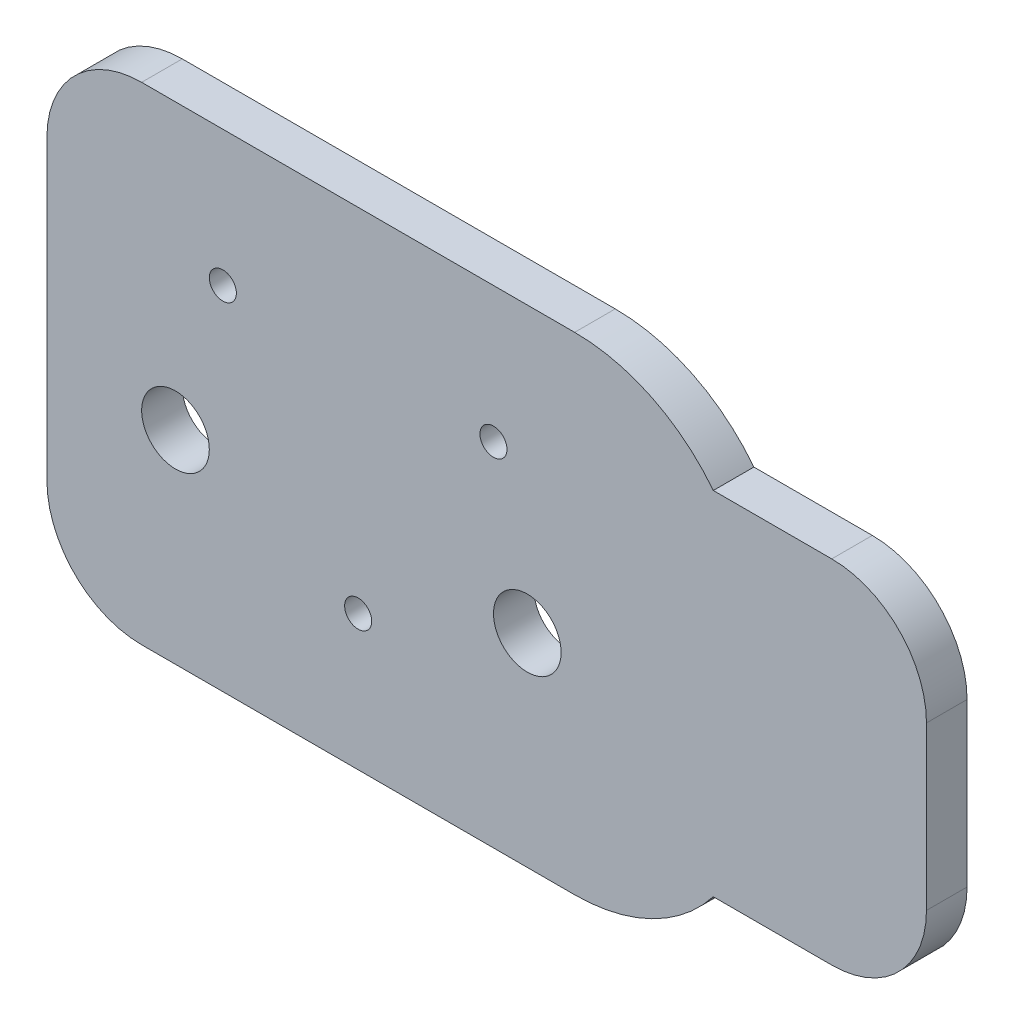
ISO-10303-21;
HEADER;
FILE_DESCRIPTION(('STEP AP214'),'2;1');
FILE_NAME('part.step','',(''),(''),'','','');
FILE_SCHEMA(('AUTOMOTIVE_DESIGN { 1 0 10303 214 1 1 1 1 }'));
ENDSEC;
DATA;
#1=APPLICATION_CONTEXT('core data for automotive mechanical design processes');
#2=APPLICATION_PROTOCOL_DEFINITION('international standard','automotive_design',2000,#1);
#3=PRODUCT_CONTEXT('',#1,'mechanical');
#4=PRODUCT('Part','Part','',(#3));
#5=PRODUCT_RELATED_PRODUCT_CATEGORY('part','',(#4));
#6=PRODUCT_DEFINITION_FORMATION('','',#4);
#7=PRODUCT_DEFINITION_CONTEXT('part definition',#1,'design');
#8=PRODUCT_DEFINITION('design','',#6,#7);
#9=PRODUCT_DEFINITION_SHAPE('','',#8);
#10=(LENGTH_UNIT() NAMED_UNIT(*) SI_UNIT(.MILLI.,.METRE.));
#11=(NAMED_UNIT(*) PLANE_ANGLE_UNIT() SI_UNIT($,.RADIAN.));
#12=(NAMED_UNIT(*) SI_UNIT($,.STERADIAN.) SOLID_ANGLE_UNIT());
#13=UNCERTAINTY_MEASURE_WITH_UNIT(LENGTH_MEASURE(1.E-05),#10,'distance_accuracy_value','');
#14=(GEOMETRIC_REPRESENTATION_CONTEXT(3) GLOBAL_UNCERTAINTY_ASSIGNED_CONTEXT((#13)) GLOBAL_UNIT_ASSIGNED_CONTEXT((#10,
#11,#12)) REPRESENTATION_CONTEXT('',''));
#15=CARTESIAN_POINT('',(0.,0.,0.));
#16=DIRECTION('',(0.,0.,1.));
#17=DIRECTION('',(1.,0.,0.));
#18=AXIS2_PLACEMENT_3D('',#15,#16,#17);
#19=CARTESIAN_POINT('',(16.,-5.00000000000001,-2.));
#20=DIRECTION('',(0.,0.,1.));
#21=DIRECTION('',(1.,0.,0.));
#22=AXIS2_PLACEMENT_3D('',#19,#20,#21);
#23=CYLINDRICAL_SURFACE('',#22,13.);
#24=CARTESIAN_POINT('',(16.,-5.00000000000001,1.));
#25=DIRECTION('',(0.,0.,1.));
#26=DIRECTION('',(1.,0.,0.));
#27=AXIS2_PLACEMENT_3D('',#24,#25,#26);
#28=CIRCLE('',#27,13.);
#29=CARTESIAN_POINT('',(16.,-18.,1.));
#30=VERTEX_POINT('',#29);
#31=CARTESIAN_POINT('',(26.2469507659596,-13.,1.));
#32=VERTEX_POINT('',#31);
#33=EDGE_CURVE('E156',#30,#32,#28,.T.);
#34=ORIENTED_EDGE('',*,*,#33,.F.);
#35=DIRECTION('',(0.,0.,1.));
#36=VECTOR('',#35,1.);
#37=CARTESIAN_POINT('',(16.,-18.,-2.));
#38=LINE('',#37,#36);
#39=CARTESIAN_POINT('',(16.,-18.,-2.));
#40=VERTEX_POINT('',#39);
#41=EDGE_CURVE('E11',#40,#30,#38,.T.);
#42=ORIENTED_EDGE('',*,*,#41,.F.);
#43=CARTESIAN_POINT('',(16.,-5.00000000000001,-2.));
#44=DIRECTION('',(0.,0.,1.));
#45=DIRECTION('',(1.,0.,0.));
#46=AXIS2_PLACEMENT_3D('',#43,#44,#45);
#47=CIRCLE('',#46,13.);
#48=CARTESIAN_POINT('',(26.2469507659596,-13.,-2.));
#49=VERTEX_POINT('',#48);
#50=EDGE_CURVE('E189',#40,#49,#47,.T.);
#51=ORIENTED_EDGE('',*,*,#50,.T.);
#52=DIRECTION('',(0.,0.,1.));
#53=VECTOR('',#52,1.);
#54=CARTESIAN_POINT('',(26.2469507659596,-13.,-2.));
#55=LINE('',#54,#53);
#56=EDGE_CURVE('E102',#49,#32,#55,.T.);
#57=ORIENTED_EDGE('',*,*,#56,.T.);
#58=EDGE_LOOP('',(#34,#42,#51,#57));
#59=FACE_BOUND('',#58,.T.);
#60=ADVANCED_FACE('F33',(#59),#23,.T.);
#61=CARTESIAN_POINT('',(-16.,-18.,-2.));
#62=DIRECTION('',(0.,-1.,0.));
#63=DIRECTION('',(0.,0.,-1.));
#64=AXIS2_PLACEMENT_3D('',#61,#62,#63);
#65=PLANE('',#64);
#66=DIRECTION('',(1.,0.,0.));
#67=VECTOR('',#66,1.);
#68=CARTESIAN_POINT('',(-16.,-18.,1.));
#69=LINE('',#68,#67);
#70=CARTESIAN_POINT('',(-16.,-18.,1.));
#71=VERTEX_POINT('',#70);
#72=EDGE_CURVE('E187',#71,#30,#69,.T.);
#73=ORIENTED_EDGE('',*,*,#72,.F.);
#74=DIRECTION('',(0.,0.,1.));
#75=VECTOR('',#74,1.);
#76=CARTESIAN_POINT('',(-16.,-18.,-2.));
#77=LINE('',#76,#75);
#78=CARTESIAN_POINT('',(-16.,-18.,-2.));
#79=VERTEX_POINT('',#78);
#80=EDGE_CURVE('E43',#79,#71,#77,.T.);
#81=ORIENTED_EDGE('',*,*,#80,.F.);
#82=DIRECTION('',(1.,0.,0.));
#83=VECTOR('',#82,1.);
#84=CARTESIAN_POINT('',(-16.,-18.,-2.));
#85=LINE('',#84,#83);
#86=EDGE_CURVE('E146',#79,#40,#85,.T.);
#87=ORIENTED_EDGE('',*,*,#86,.T.);
#88=ORIENTED_EDGE('',*,*,#41,.T.);
#89=EDGE_LOOP('',(#73,#81,#87,#88));
#90=FACE_BOUND('',#89,.T.);
#91=ADVANCED_FACE('F283',(#90),#65,.T.);
#92=CARTESIAN_POINT('',(-16.,-11.,-2.));
#93=DIRECTION('',(0.,0.,1.));
#94=DIRECTION('',(1.,0.,0.));
#95=AXIS2_PLACEMENT_3D('',#92,#93,#94);
#96=CYLINDRICAL_SURFACE('',#95,7.);
#97=CARTESIAN_POINT('',(-16.,-11.,1.));
#98=DIRECTION('',(0.,0.,1.));
#99=DIRECTION('',(1.,0.,0.));
#100=AXIS2_PLACEMENT_3D('',#97,#98,#99);
#101=CIRCLE('',#100,7.);
#102=CARTESIAN_POINT('',(-23.,-11.,1.));
#103=VERTEX_POINT('',#102);
#104=EDGE_CURVE('E133',#103,#71,#101,.T.);
#105=ORIENTED_EDGE('',*,*,#104,.F.);
#106=DIRECTION('',(0.,0.,1.));
#107=VECTOR('',#106,1.);
#108=CARTESIAN_POINT('',(-23.,-11.,-2.));
#109=LINE('',#108,#107);
#110=CARTESIAN_POINT('',(-23.,-11.,-2.));
#111=VERTEX_POINT('',#110);
#112=EDGE_CURVE('E128',#111,#103,#109,.T.);
#113=ORIENTED_EDGE('',*,*,#112,.F.);
#114=CARTESIAN_POINT('',(-16.,-11.,-2.));
#115=DIRECTION('',(0.,0.,1.));
#116=DIRECTION('',(1.,0.,0.));
#117=AXIS2_PLACEMENT_3D('',#114,#115,#116);
#118=CIRCLE('',#117,7.);
#119=EDGE_CURVE('E131',#111,#79,#118,.T.);
#120=ORIENTED_EDGE('',*,*,#119,.T.);
#121=ORIENTED_EDGE('',*,*,#80,.T.);
#122=EDGE_LOOP('',(#105,#113,#120,#121));
#123=FACE_BOUND('',#122,.T.);
#124=ADVANCED_FACE('F130',(#123),#96,.T.);
#125=CARTESIAN_POINT('',(-23.,11.,-2.));
#126=DIRECTION('',(-1.,0.,0.));
#127=DIRECTION('',(0.,-1.,0.));
#128=AXIS2_PLACEMENT_3D('',#125,#126,#127);
#129=PLANE('',#128);
#130=DIRECTION('',(0.,-1.,0.));
#131=VECTOR('',#130,1.);
#132=CARTESIAN_POINT('',(-23.,11.,1.));
#133=LINE('',#132,#131);
#134=CARTESIAN_POINT('',(-23.,11.,1.));
#135=VERTEX_POINT('',#134);
#136=EDGE_CURVE('E184',#135,#103,#133,.T.);
#137=ORIENTED_EDGE('',*,*,#136,.F.);
#138=DIRECTION('',(0.,0.,1.));
#139=VECTOR('',#138,1.);
#140=CARTESIAN_POINT('',(-23.,11.,-2.));
#141=LINE('',#140,#139);
#142=CARTESIAN_POINT('',(-23.,11.,-2.));
#143=VERTEX_POINT('',#142);
#144=EDGE_CURVE('E138',#143,#135,#141,.T.);
#145=ORIENTED_EDGE('',*,*,#144,.F.);
#146=DIRECTION('',(0.,-1.,0.));
#147=VECTOR('',#146,1.);
#148=CARTESIAN_POINT('',(-23.,11.,-2.));
#149=LINE('',#148,#147);
#150=EDGE_CURVE('E144',#143,#111,#149,.T.);
#151=ORIENTED_EDGE('',*,*,#150,.T.);
#152=ORIENTED_EDGE('',*,*,#112,.T.);
#153=EDGE_LOOP('',(#137,#145,#151,#152));
#154=FACE_BOUND('',#153,.T.);
#155=ADVANCED_FACE('F148',(#154),#129,.T.);
#156=CARTESIAN_POINT('',(-16.,11.,-2.));
#157=DIRECTION('',(0.,0.,1.));
#158=DIRECTION('',(1.,0.,0.));
#159=AXIS2_PLACEMENT_3D('',#156,#157,#158);
#160=CYLINDRICAL_SURFACE('',#159,7.00000000000001);
#161=CARTESIAN_POINT('',(-16.,11.,1.));
#162=DIRECTION('',(0.,0.,1.));
#163=DIRECTION('',(1.,0.,0.));
#164=AXIS2_PLACEMENT_3D('',#161,#162,#163);
#165=CIRCLE('',#164,7.00000000000001);
#166=CARTESIAN_POINT('',(-16.,18.,1.));
#167=VERTEX_POINT('',#166);
#168=EDGE_CURVE('E181',#167,#135,#165,.T.);
#169=ORIENTED_EDGE('',*,*,#168,.F.);
#170=DIRECTION('',(0.,0.,1.));
#171=VECTOR('',#170,1.);
#172=CARTESIAN_POINT('',(-16.,18.,-2.));
#173=LINE('',#172,#171);
#174=CARTESIAN_POINT('',(-16.,18.,-2.));
#175=VERTEX_POINT('',#174);
#176=EDGE_CURVE('E193',#175,#167,#173,.T.);
#177=ORIENTED_EDGE('',*,*,#176,.F.);
#178=CARTESIAN_POINT('',(-16.,11.,-2.));
#179=DIRECTION('',(0.,0.,1.));
#180=DIRECTION('',(1.,0.,0.));
#181=AXIS2_PLACEMENT_3D('',#178,#179,#180);
#182=CIRCLE('',#181,7.00000000000001);
#183=EDGE_CURVE('E149',#175,#143,#182,.T.);
#184=ORIENTED_EDGE('',*,*,#183,.T.);
#185=ORIENTED_EDGE('',*,*,#144,.T.);
#186=EDGE_LOOP('',(#169,#177,#184,#185));
#187=FACE_BOUND('',#186,.T.);
#188=ADVANCED_FACE('F296',(#187),#160,.T.);
#189=CARTESIAN_POINT('',(16.,18.,-2.));
#190=DIRECTION('',(0.,1.,0.));
#191=DIRECTION('',(-1.,0.,0.));
#192=AXIS2_PLACEMENT_3D('',#189,#190,#191);
#193=PLANE('',#192);
#194=DIRECTION('',(-1.,0.,0.));
#195=VECTOR('',#194,1.);
#196=CARTESIAN_POINT('',(16.,18.,1.));
#197=LINE('',#196,#195);
#198=CARTESIAN_POINT('',(16.,18.,1.));
#199=VERTEX_POINT('',#198);
#200=EDGE_CURVE('E178',#199,#167,#197,.T.);
#201=ORIENTED_EDGE('',*,*,#200,.F.);
#202=DIRECTION('',(0.,0.,1.));
#203=VECTOR('',#202,1.);
#204=CARTESIAN_POINT('',(16.,18.,-2.));
#205=LINE('',#204,#203);
#206=CARTESIAN_POINT('',(16.,18.,-2.));
#207=VERTEX_POINT('',#206);
#208=EDGE_CURVE('E195',#207,#199,#205,.T.);
#209=ORIENTED_EDGE('',*,*,#208,.F.);
#210=DIRECTION('',(-1.,0.,0.));
#211=VECTOR('',#210,1.);
#212=CARTESIAN_POINT('',(16.,18.,-2.));
#213=LINE('',#212,#211);
#214=EDGE_CURVE('E151',#207,#175,#213,.T.);
#215=ORIENTED_EDGE('',*,*,#214,.T.);
#216=ORIENTED_EDGE('',*,*,#176,.T.);
#217=EDGE_LOOP('',(#201,#209,#215,#216));
#218=FACE_BOUND('',#217,.T.);
#219=ADVANCED_FACE('F259',(#218),#193,.T.);
#220=CARTESIAN_POINT('',(16.,5.00000000000001,-2.));
#221=DIRECTION('',(0.,0.,1.));
#222=DIRECTION('',(1.,0.,0.));
#223=AXIS2_PLACEMENT_3D('',#220,#221,#222);
#224=CYLINDRICAL_SURFACE('',#223,13.);
#225=CARTESIAN_POINT('',(16.,5.00000000000001,1.));
#226=DIRECTION('',(0.,0.,1.));
#227=DIRECTION('',(1.,0.,0.));
#228=AXIS2_PLACEMENT_3D('',#225,#226,#227);
#229=CIRCLE('',#228,13.);
#230=CARTESIAN_POINT('',(26.2469507659596,13.,1.));
#231=VERTEX_POINT('',#230);
#232=EDGE_CURVE('E175',#231,#199,#229,.T.);
#233=ORIENTED_EDGE('',*,*,#232,.F.);
#234=DIRECTION('',(0.,0.,1.));
#235=VECTOR('',#234,1.);
#236=CARTESIAN_POINT('',(26.2469507659596,13.,-2.));
#237=LINE('',#236,#235);
#238=CARTESIAN_POINT('',(26.2469507659596,13.,-2.));
#239=VERTEX_POINT('',#238);
#240=EDGE_CURVE('E197',#239,#231,#237,.T.);
#241=ORIENTED_EDGE('',*,*,#240,.F.);
#242=CARTESIAN_POINT('',(16.,5.00000000000001,-2.));
#243=DIRECTION('',(0.,0.,1.));
#244=DIRECTION('',(1.,0.,0.));
#245=AXIS2_PLACEMENT_3D('',#242,#243,#244);
#246=CIRCLE('',#245,13.);
#247=EDGE_CURVE('E253',#239,#207,#246,.T.);
#248=ORIENTED_EDGE('',*,*,#247,.T.);
#249=ORIENTED_EDGE('',*,*,#208,.T.);
#250=EDGE_LOOP('',(#233,#241,#248,#249));
#251=FACE_BOUND('',#250,.T.);
#252=ADVANCED_FACE('F265',(#251),#224,.T.);
#253=CARTESIAN_POINT('',(35.,13.,-2.));
#254=DIRECTION('',(0.,1.,0.));
#255=DIRECTION('',(0.,0.,1.));
#256=AXIS2_PLACEMENT_3D('',#253,#254,#255);
#257=PLANE('',#256);
#258=DIRECTION('',(-1.,0.,0.));
#259=VECTOR('',#258,1.);
#260=CARTESIAN_POINT('',(35.,13.,1.));
#261=LINE('',#260,#259);
#262=CARTESIAN_POINT('',(35.,13.,1.));
#263=VERTEX_POINT('',#262);
#264=EDGE_CURVE('E172',#263,#231,#261,.T.);
#265=ORIENTED_EDGE('',*,*,#264,.F.);
#266=DIRECTION('',(0.,0.,1.));
#267=VECTOR('',#266,1.);
#268=CARTESIAN_POINT('',(35.,13.,-2.));
#269=LINE('',#268,#267);
#270=CARTESIAN_POINT('',(35.,13.,-2.));
#271=VERTEX_POINT('',#270);
#272=EDGE_CURVE('E199',#271,#263,#269,.T.);
#273=ORIENTED_EDGE('',*,*,#272,.F.);
#274=DIRECTION('',(-1.,0.,0.));
#275=VECTOR('',#274,1.);
#276=CARTESIAN_POINT('',(35.,13.,-2.));
#277=LINE('',#276,#275);
#278=EDGE_CURVE('E250',#271,#239,#277,.T.);
#279=ORIENTED_EDGE('',*,*,#278,.T.);
#280=ORIENTED_EDGE('',*,*,#240,.T.);
#281=EDGE_LOOP('',(#265,#273,#279,#280));
#282=FACE_BOUND('',#281,.T.);
#283=ADVANCED_FACE('F268',(#282),#257,.T.);
#284=CARTESIAN_POINT('',(35.,6.,-2.));
#285=DIRECTION('',(0.,0.,1.));
#286=DIRECTION('',(1.,0.,0.));
#287=AXIS2_PLACEMENT_3D('',#284,#285,#286);
#288=CYLINDRICAL_SURFACE('',#287,7.);
#289=CARTESIAN_POINT('',(35.,6.,1.));
#290=DIRECTION('',(0.,0.,1.));
#291=DIRECTION('',(1.,0.,0.));
#292=AXIS2_PLACEMENT_3D('',#289,#290,#291);
#293=CIRCLE('',#292,7.);
#294=CARTESIAN_POINT('',(42.,6.,1.));
#295=VERTEX_POINT('',#294);
#296=EDGE_CURVE('E169',#295,#263,#293,.T.);
#297=ORIENTED_EDGE('',*,*,#296,.F.);
#298=DIRECTION('',(0.,0.,1.));
#299=VECTOR('',#298,1.);
#300=CARTESIAN_POINT('',(42.,6.,-2.));
#301=LINE('',#300,#299);
#302=CARTESIAN_POINT('',(42.,6.,-2.));
#303=VERTEX_POINT('',#302);
#304=EDGE_CURVE('E201',#303,#295,#301,.T.);
#305=ORIENTED_EDGE('',*,*,#304,.F.);
#306=CARTESIAN_POINT('',(35.,6.,-2.));
#307=DIRECTION('',(0.,0.,1.));
#308=DIRECTION('',(1.,0.,0.));
#309=AXIS2_PLACEMENT_3D('',#306,#307,#308);
#310=CIRCLE('',#309,7.);
#311=EDGE_CURVE('E247',#303,#271,#310,.T.);
#312=ORIENTED_EDGE('',*,*,#311,.T.);
#313=ORIENTED_EDGE('',*,*,#272,.T.);
#314=EDGE_LOOP('',(#297,#305,#312,#313));
#315=FACE_BOUND('',#314,.T.);
#316=ADVANCED_FACE('F273',(#315),#288,.T.);
#317=CARTESIAN_POINT('',(42.,-6.,-2.));
#318=DIRECTION('',(1.,0.,0.));
#319=DIRECTION('',(0.,0.,-1.));
#320=AXIS2_PLACEMENT_3D('',#317,#318,#319);
#321=PLANE('',#320);
#322=DIRECTION('',(0.,1.,0.));
#323=VECTOR('',#322,1.);
#324=CARTESIAN_POINT('',(42.,-6.,1.));
#325=LINE('',#324,#323);
#326=CARTESIAN_POINT('',(42.,-6.,1.));
#327=VERTEX_POINT('',#326);
#328=EDGE_CURVE('E166',#327,#295,#325,.T.);
#329=ORIENTED_EDGE('',*,*,#328,.F.);
#330=DIRECTION('',(0.,0.,1.));
#331=VECTOR('',#330,1.);
#332=CARTESIAN_POINT('',(42.,-6.,-2.));
#333=LINE('',#332,#331);
#334=CARTESIAN_POINT('',(42.,-6.,-2.));
#335=VERTEX_POINT('',#334);
#336=EDGE_CURVE('E203',#335,#327,#333,.T.);
#337=ORIENTED_EDGE('',*,*,#336,.F.);
#338=DIRECTION('',(0.,1.,0.));
#339=VECTOR('',#338,1.);
#340=CARTESIAN_POINT('',(42.,-6.,-2.));
#341=LINE('',#340,#339);
#342=EDGE_CURVE('E244',#335,#303,#341,.T.);
#343=ORIENTED_EDGE('',*,*,#342,.T.);
#344=ORIENTED_EDGE('',*,*,#304,.T.);
#345=EDGE_LOOP('',(#329,#337,#343,#344));
#346=FACE_BOUND('',#345,.T.);
#347=ADVANCED_FACE('F276',(#346),#321,.T.);
#348=CARTESIAN_POINT('',(35.,-6.,-2.));
#349=DIRECTION('',(0.,0.,1.));
#350=DIRECTION('',(1.,0.,0.));
#351=AXIS2_PLACEMENT_3D('',#348,#349,#350);
#352=CYLINDRICAL_SURFACE('',#351,7.);
#353=CARTESIAN_POINT('',(35.,-6.,1.));
#354=DIRECTION('',(0.,0.,1.));
#355=DIRECTION('',(1.,0.,0.));
#356=AXIS2_PLACEMENT_3D('',#353,#354,#355);
#357=CIRCLE('',#356,7.);
#358=CARTESIAN_POINT('',(35.,-13.,1.));
#359=VERTEX_POINT('',#358);
#360=EDGE_CURVE('E163',#359,#327,#357,.T.);
#361=ORIENTED_EDGE('',*,*,#360,.F.);
#362=DIRECTION('',(0.,0.,1.));
#363=VECTOR('',#362,1.);
#364=CARTESIAN_POINT('',(35.,-13.,-2.));
#365=LINE('',#364,#363);
#366=CARTESIAN_POINT('',(35.,-13.,-2.));
#367=VERTEX_POINT('',#366);
#368=EDGE_CURVE('E205',#367,#359,#365,.T.);
#369=ORIENTED_EDGE('',*,*,#368,.F.);
#370=CARTESIAN_POINT('',(35.,-6.,-2.));
#371=DIRECTION('',(0.,0.,1.));
#372=DIRECTION('',(1.,0.,0.));
#373=AXIS2_PLACEMENT_3D('',#370,#371,#372);
#374=CIRCLE('',#373,7.);
#375=EDGE_CURVE('E241',#367,#335,#374,.T.);
#376=ORIENTED_EDGE('',*,*,#375,.T.);
#377=ORIENTED_EDGE('',*,*,#336,.T.);
#378=EDGE_LOOP('',(#361,#369,#376,#377));
#379=FACE_BOUND('',#378,.T.);
#380=ADVANCED_FACE('F280',(#379),#352,.T.);
#381=CARTESIAN_POINT('',(26.2469507659596,-13.,-2.));
#382=DIRECTION('',(0.,-1.,0.));
#383=DIRECTION('',(1.,0.,0.));
#384=AXIS2_PLACEMENT_3D('',#381,#382,#383);
#385=PLANE('',#384);
#386=DIRECTION('',(1.,0.,0.));
#387=VECTOR('',#386,1.);
#388=CARTESIAN_POINT('',(26.2469507659596,-13.,1.));
#389=LINE('',#388,#387);
#390=EDGE_CURVE('E159',#32,#359,#389,.T.);
#391=ORIENTED_EDGE('',*,*,#390,.F.);
#392=ORIENTED_EDGE('',*,*,#56,.F.);
#393=DIRECTION('',(1.,0.,0.));
#394=VECTOR('',#393,1.);
#395=CARTESIAN_POINT('',(26.2469507659596,-13.,-2.));
#396=LINE('',#395,#394);
#397=EDGE_CURVE('E239',#49,#367,#396,.T.);
#398=ORIENTED_EDGE('',*,*,#397,.T.);
#399=ORIENTED_EDGE('',*,*,#368,.T.);
#400=EDGE_LOOP('',(#391,#392,#398,#399));
#401=FACE_BOUND('',#400,.T.);
#402=ADVANCED_FACE('F281',(#401),#385,.T.);
#403=CARTESIAN_POINT('',(16.,-5.00000000000001,-2.));
#404=DIRECTION('',(0.,0.,1.));
#405=DIRECTION('',(1.,0.,0.));
#406=AXIS2_PLACEMENT_3D('',#403,#404,#405);
#407=PLANE('',#406);
#408=CARTESIAN_POINT('',(-13.5,-3.,-2.));
#409=DIRECTION('',(0.,0.,1.));
#410=DIRECTION('',(1.,0.,0.));
#411=AXIS2_PLACEMENT_3D('',#408,#409,#410);
#412=CIRCLE('',#411,2.5);
#413=CARTESIAN_POINT('',(-11.,-3.,-2.));
#414=VERTEX_POINT('',#413);
#415=EDGE_CURVE('E218',#414,#414,#412,.T.);
#416=ORIENTED_EDGE('',*,*,#415,.T.);
#417=EDGE_LOOP('',(#416));
#418=FACE_BOUND('',#417,.T.);
#419=CARTESIAN_POINT('',(12.5,-3.,-2.));
#420=DIRECTION('',(0.,0.,1.));
#421=DIRECTION('',(1.,0.,0.));
#422=AXIS2_PLACEMENT_3D('',#419,#420,#421);
#423=CIRCLE('',#422,2.5);
#424=CARTESIAN_POINT('',(15.,-3.,-2.));
#425=VERTEX_POINT('',#424);
#426=EDGE_CURVE('E224',#425,#425,#423,.T.);
#427=ORIENTED_EDGE('',*,*,#426,.T.);
#428=EDGE_LOOP('',(#427));
#429=FACE_BOUND('',#428,.T.);
#430=CARTESIAN_POINT('',(-10.,8.,-2.));
#431=DIRECTION('',(0.,0.,1.));
#432=DIRECTION('',(1.,0.,0.));
#433=AXIS2_PLACEMENT_3D('',#430,#431,#432);
#434=CIRCLE('',#433,0.999999999999999);
#435=CARTESIAN_POINT('',(-9.00000000000001,8.,-2.));
#436=VERTEX_POINT('',#435);
#437=EDGE_CURVE('E212',#436,#436,#434,.T.);
#438=ORIENTED_EDGE('',*,*,#437,.T.);
#439=EDGE_LOOP('',(#438));
#440=FACE_BOUND('',#439,.T.);
#441=CARTESIAN_POINT('',(10.,8.,-2.));
#442=DIRECTION('',(0.,0.,1.));
#443=DIRECTION('',(1.,0.,0.));
#444=AXIS2_PLACEMENT_3D('',#441,#442,#443);
#445=CIRCLE('',#444,1.);
#446=CARTESIAN_POINT('',(11.,8.,-2.));
#447=VERTEX_POINT('',#446);
#448=EDGE_CURVE('E233',#447,#447,#445,.T.);
#449=ORIENTED_EDGE('',*,*,#448,.T.);
#450=EDGE_LOOP('',(#449));
#451=FACE_BOUND('',#450,.T.);
#452=CARTESIAN_POINT('',(0.,-8.,-2.));
#453=DIRECTION('',(0.,0.,1.));
#454=DIRECTION('',(1.,0.,0.));
#455=AXIS2_PLACEMENT_3D('',#452,#453,#454);
#456=CIRCLE('',#455,1.);
#457=CARTESIAN_POINT('',(1.,-8.,-2.));
#458=VERTEX_POINT('',#457);
#459=EDGE_CURVE('E222',#458,#458,#456,.T.);
#460=ORIENTED_EDGE('',*,*,#459,.T.);
#461=EDGE_LOOP('',(#460));
#462=FACE_BOUND('',#461,.T.);
#463=ORIENTED_EDGE('',*,*,#50,.F.);
#464=ORIENTED_EDGE('',*,*,#86,.F.);
#465=ORIENTED_EDGE('',*,*,#119,.F.);
#466=ORIENTED_EDGE('',*,*,#150,.F.);
#467=ORIENTED_EDGE('',*,*,#183,.F.);
#468=ORIENTED_EDGE('',*,*,#214,.F.);
#469=ORIENTED_EDGE('',*,*,#247,.F.);
#470=ORIENTED_EDGE('',*,*,#278,.F.);
#471=ORIENTED_EDGE('',*,*,#311,.F.);
#472=ORIENTED_EDGE('',*,*,#342,.F.);
#473=ORIENTED_EDGE('',*,*,#375,.F.);
#474=ORIENTED_EDGE('',*,*,#397,.F.);
#475=EDGE_LOOP('',(#463,#464,#465,#466,#467,#468,#469,#470,#471,#472,#473,#474));
#476=FACE_BOUND('',#475,.T.);
#477=ADVANCED_FACE('F142',(#418,#429,#440,#451,#462,#476),#407,.F.);
#478=CARTESIAN_POINT('',(16.,-5.00000000000001,1.));
#479=DIRECTION('',(0.,0.,1.));
#480=DIRECTION('',(1.,0.,0.));
#481=AXIS2_PLACEMENT_3D('',#478,#479,#480);
#482=PLANE('',#481);
#483=CARTESIAN_POINT('',(-13.5,-3.,1.));
#484=DIRECTION('',(0.,0.,1.));
#485=DIRECTION('',(1.,0.,0.));
#486=AXIS2_PLACEMENT_3D('',#483,#484,#485);
#487=CIRCLE('',#486,2.5);
#488=CARTESIAN_POINT('',(-11.,-3.,1.));
#489=VERTEX_POINT('',#488);
#490=EDGE_CURVE('E37',#489,#489,#487,.T.);
#491=ORIENTED_EDGE('',*,*,#490,.F.);
#492=EDGE_LOOP('',(#491));
#493=FACE_BOUND('',#492,.T.);
#494=CARTESIAN_POINT('',(12.5,-3.,1.));
#495=DIRECTION('',(0.,0.,1.));
#496=DIRECTION('',(1.,0.,0.));
#497=AXIS2_PLACEMENT_3D('',#494,#495,#496);
#498=CIRCLE('',#497,2.5);
#499=CARTESIAN_POINT('',(15.,-3.,1.));
#500=VERTEX_POINT('',#499);
#501=EDGE_CURVE('E216',#500,#500,#498,.T.);
#502=ORIENTED_EDGE('',*,*,#501,.F.);
#503=EDGE_LOOP('',(#502));
#504=FACE_BOUND('',#503,.T.);
#505=CARTESIAN_POINT('',(-10.,8.,1.));
#506=DIRECTION('',(0.,0.,1.));
#507=DIRECTION('',(1.,0.,0.));
#508=AXIS2_PLACEMENT_3D('',#505,#506,#507);
#509=CIRCLE('',#508,0.999999999999999);
#510=CARTESIAN_POINT('',(-9.00000000000001,8.,1.));
#511=VERTEX_POINT('',#510);
#512=EDGE_CURVE('E160',#511,#511,#509,.T.);
#513=ORIENTED_EDGE('',*,*,#512,.F.);
#514=EDGE_LOOP('',(#513));
#515=FACE_BOUND('',#514,.T.);
#516=CARTESIAN_POINT('',(10.,8.,1.));
#517=DIRECTION('',(0.,0.,1.));
#518=DIRECTION('',(1.,0.,0.));
#519=AXIS2_PLACEMENT_3D('',#516,#517,#518);
#520=CIRCLE('',#519,1.);
#521=CARTESIAN_POINT('',(11.,8.,1.));
#522=VERTEX_POINT('',#521);
#523=EDGE_CURVE('E211',#522,#522,#520,.T.);
#524=ORIENTED_EDGE('',*,*,#523,.F.);
#525=EDGE_LOOP('',(#524));
#526=FACE_BOUND('',#525,.T.);
#527=CARTESIAN_POINT('',(0.,-8.,1.));
#528=DIRECTION('',(0.,0.,1.));
#529=DIRECTION('',(1.,0.,0.));
#530=AXIS2_PLACEMENT_3D('',#527,#528,#529);
#531=CIRCLE('',#530,1.);
#532=CARTESIAN_POINT('',(1.,-8.,1.));
#533=VERTEX_POINT('',#532);
#534=EDGE_CURVE('E208',#533,#533,#531,.T.);
#535=ORIENTED_EDGE('',*,*,#534,.F.);
#536=EDGE_LOOP('',(#535));
#537=FACE_BOUND('',#536,.T.);
#538=ORIENTED_EDGE('',*,*,#33,.T.);
#539=ORIENTED_EDGE('',*,*,#390,.T.);
#540=ORIENTED_EDGE('',*,*,#360,.T.);
#541=ORIENTED_EDGE('',*,*,#328,.T.);
#542=ORIENTED_EDGE('',*,*,#296,.T.);
#543=ORIENTED_EDGE('',*,*,#264,.T.);
#544=ORIENTED_EDGE('',*,*,#232,.T.);
#545=ORIENTED_EDGE('',*,*,#200,.T.);
#546=ORIENTED_EDGE('',*,*,#168,.T.);
#547=ORIENTED_EDGE('',*,*,#136,.T.);
#548=ORIENTED_EDGE('',*,*,#104,.T.);
#549=ORIENTED_EDGE('',*,*,#72,.T.);
#550=EDGE_LOOP('',(#538,#539,#540,#541,#542,#543,#544,#545,#546,#547,#548,#549));
#551=FACE_BOUND('',#550,.T.);
#552=ADVANCED_FACE('F35',(#493,#504,#515,#526,#537,#551),#482,.T.);
#553=CARTESIAN_POINT('',(0.,-8.,-2.));
#554=DIRECTION('',(0.,0.,1.));
#555=DIRECTION('',(1.,0.,0.));
#556=AXIS2_PLACEMENT_3D('',#553,#554,#555);
#557=CYLINDRICAL_SURFACE('',#556,1.);
#558=ORIENTED_EDGE('',*,*,#534,.T.);
#559=EDGE_LOOP('',(#558));
#560=FACE_BOUND('',#559,.T.);
#561=ORIENTED_EDGE('',*,*,#459,.F.);
#562=EDGE_LOOP('',(#561));
#563=FACE_BOUND('',#562,.T.);
#564=ADVANCED_FACE('F319',(#560,#563),#557,.F.);
#565=CARTESIAN_POINT('',(10.,8.,-2.));
#566=DIRECTION('',(0.,0.,1.));
#567=DIRECTION('',(1.,0.,0.));
#568=AXIS2_PLACEMENT_3D('',#565,#566,#567);
#569=CYLINDRICAL_SURFACE('',#568,1.);
#570=ORIENTED_EDGE('',*,*,#523,.T.);
#571=EDGE_LOOP('',(#570));
#572=FACE_BOUND('',#571,.T.);
#573=ORIENTED_EDGE('',*,*,#448,.F.);
#574=EDGE_LOOP('',(#573));
#575=FACE_BOUND('',#574,.T.);
#576=ADVANCED_FACE('F331',(#572,#575),#569,.F.);
#577=CARTESIAN_POINT('',(-10.,8.,-2.));
#578=DIRECTION('',(0.,0.,1.));
#579=DIRECTION('',(1.,0.,0.));
#580=AXIS2_PLACEMENT_3D('',#577,#578,#579);
#581=CYLINDRICAL_SURFACE('',#580,0.999999999999999);
#582=ORIENTED_EDGE('',*,*,#512,.T.);
#583=EDGE_LOOP('',(#582));
#584=FACE_BOUND('',#583,.T.);
#585=ORIENTED_EDGE('',*,*,#437,.F.);
#586=EDGE_LOOP('',(#585));
#587=FACE_BOUND('',#586,.T.);
#588=ADVANCED_FACE('F336',(#584,#587),#581,.F.);
#589=CARTESIAN_POINT('',(12.5,-3.,-2.));
#590=DIRECTION('',(0.,0.,1.));
#591=DIRECTION('',(1.,0.,0.));
#592=AXIS2_PLACEMENT_3D('',#589,#590,#591);
#593=CYLINDRICAL_SURFACE('',#592,2.5);
#594=ORIENTED_EDGE('',*,*,#501,.T.);
#595=EDGE_LOOP('',(#594));
#596=FACE_BOUND('',#595,.T.);
#597=ORIENTED_EDGE('',*,*,#426,.F.);
#598=EDGE_LOOP('',(#597));
#599=FACE_BOUND('',#598,.T.);
#600=ADVANCED_FACE('F342',(#596,#599),#593,.F.);
#601=CARTESIAN_POINT('',(-13.5,-3.,-2.));
#602=DIRECTION('',(0.,0.,1.));
#603=DIRECTION('',(1.,0.,0.));
#604=AXIS2_PLACEMENT_3D('',#601,#602,#603);
#605=CYLINDRICAL_SURFACE('',#604,2.5);
#606=ORIENTED_EDGE('',*,*,#490,.T.);
#607=EDGE_LOOP('',(#606));
#608=FACE_BOUND('',#607,.T.);
#609=ORIENTED_EDGE('',*,*,#415,.F.);
#610=EDGE_LOOP('',(#609));
#611=FACE_BOUND('',#610,.T.);
#612=ADVANCED_FACE('F346',(#608,#611),#605,.F.);
#613=CLOSED_SHELL('',(#60,#91,#124,#155,#188,#219,#252,#283,#316,#347,#380,#402,#477,#552,#564,
#576,#588,#600,#612));
#614=MANIFOLD_SOLID_BREP('B2',#613);
#615=ADVANCED_BREP_SHAPE_REPRESENTATION('',(#18,#614),#14);
#616=SHAPE_DEFINITION_REPRESENTATION(#9,#615);
ENDSEC;
END-ISO-10303-21;
